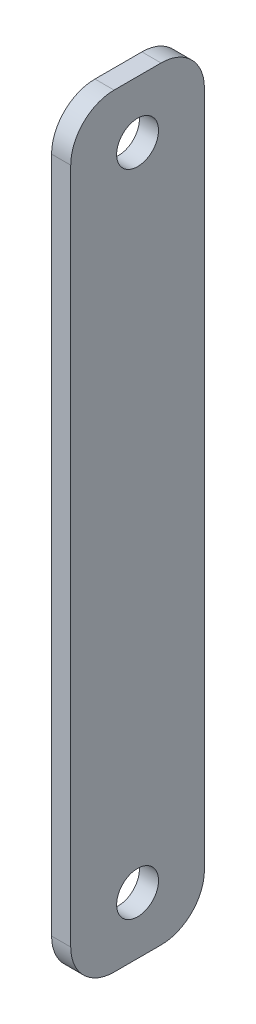
ISO-10303-21;
HEADER;
FILE_DESCRIPTION(('STEP AP214'),'2;1');
FILE_NAME('part.step','',(''),(''),'','','');
FILE_SCHEMA(('AUTOMOTIVE_DESIGN { 1 0 10303 214 1 1 1 1 }'));
ENDSEC;
DATA;
#1=APPLICATION_CONTEXT('core data for automotive mechanical design processes');
#2=APPLICATION_PROTOCOL_DEFINITION('international standard','automotive_design',2000,#1);
#3=PRODUCT_CONTEXT('',#1,'mechanical');
#4=PRODUCT('Part','Part','',(#3));
#5=PRODUCT_RELATED_PRODUCT_CATEGORY('part','',(#4));
#6=PRODUCT_DEFINITION_FORMATION('','',#4);
#7=PRODUCT_DEFINITION_CONTEXT('part definition',#1,'design');
#8=PRODUCT_DEFINITION('design','',#6,#7);
#9=PRODUCT_DEFINITION_SHAPE('','',#8);
#10=(LENGTH_UNIT() NAMED_UNIT(*) SI_UNIT(.MILLI.,.METRE.));
#11=(NAMED_UNIT(*) PLANE_ANGLE_UNIT() SI_UNIT($,.RADIAN.));
#12=(NAMED_UNIT(*) SI_UNIT($,.STERADIAN.) SOLID_ANGLE_UNIT());
#13=UNCERTAINTY_MEASURE_WITH_UNIT(LENGTH_MEASURE(1.E-05),#10,'distance_accuracy_value','');
#14=(GEOMETRIC_REPRESENTATION_CONTEXT(3) GLOBAL_UNCERTAINTY_ASSIGNED_CONTEXT((#13)) GLOBAL_UNIT_ASSIGNED_CONTEXT((#10,
#11,#12)) REPRESENTATION_CONTEXT('',''));
#15=CARTESIAN_POINT('',(0.,0.,0.));
#16=DIRECTION('',(0.,0.,1.));
#17=DIRECTION('',(1.,0.,0.));
#18=AXIS2_PLACEMENT_3D('',#15,#16,#17);
#19=CARTESIAN_POINT('',(0.6731,0.,0.));
#20=DIRECTION('',(1.,0.,0.));
#21=DIRECTION('',(0.,0.,-1.));
#22=AXIS2_PLACEMENT_3D('',#19,#20,#21);
#23=PLANE('',#22);
#24=CARTESIAN_POINT('',(0.6731,-22.8346,0.));
#25=DIRECTION('',(1.,0.,0.));
#26=DIRECTION('',(0.,0.,-1.));
#27=AXIS2_PLACEMENT_3D('',#24,#25,#26);
#28=CIRCLE('',#27,1.4732);
#29=CARTESIAN_POINT('',(0.6731,-22.8346,-1.4732));
#30=VERTEX_POINT('',#29);
#31=EDGE_CURVE('E129',#30,#30,#28,.F.);
#32=ORIENTED_EDGE('',*,*,#31,.T.);
#33=EDGE_LOOP('',(#32));
#34=FACE_BOUND('',#33,.T.);
#35=CARTESIAN_POINT('',(0.6731,22.8346,0.));
#36=DIRECTION('',(1.,0.,0.));
#37=DIRECTION('',(0.,0.,-1.));
#38=AXIS2_PLACEMENT_3D('',#35,#36,#37);
#39=CIRCLE('',#38,1.4732);
#40=CARTESIAN_POINT('',(0.6731,22.8346,-1.4732));
#41=VERTEX_POINT('',#40);
#42=EDGE_CURVE('E132',#41,#41,#39,.F.);
#43=ORIENTED_EDGE('',*,*,#42,.T.);
#44=EDGE_LOOP('',(#43));
#45=FACE_BOUND('',#44,.T.);
#46=DIRECTION('',(0.,1.,0.));
#47=VECTOR('',#46,1.);
#48=CARTESIAN_POINT('',(0.6731,-26.8478,-4.699));
#49=LINE('',#48,#47);
#50=CARTESIAN_POINT('',(0.6731,23.7998,-4.699));
#51=VERTEX_POINT('',#50);
#52=CARTESIAN_POINT('',(0.6731,-23.7998,-4.699));
#53=VERTEX_POINT('',#52);
#54=EDGE_CURVE('E92',#51,#53,#49,.F.);
#55=ORIENTED_EDGE('',*,*,#54,.F.);
#56=CARTESIAN_POINT('',(0.6731,23.7998,-1.651));
#57=DIRECTION('',(-1.,0.,0.));
#58=DIRECTION('',(0.,0.,1.));
#59=AXIS2_PLACEMENT_3D('',#56,#57,#58);
#60=CIRCLE('',#59,3.048);
#61=CARTESIAN_POINT('',(0.6731,26.8478,-1.651));
#62=VERTEX_POINT('',#61);
#63=EDGE_CURVE('E19',#62,#51,#60,.T.);
#64=ORIENTED_EDGE('',*,*,#63,.F.);
#65=DIRECTION('',(0.,0.,1.));
#66=VECTOR('',#65,1.);
#67=CARTESIAN_POINT('',(0.6731,26.8478,-4.699));
#68=LINE('',#67,#66);
#69=CARTESIAN_POINT('',(0.6731,26.8478,1.651));
#70=VERTEX_POINT('',#69);
#71=EDGE_CURVE('E78',#70,#62,#68,.F.);
#72=ORIENTED_EDGE('',*,*,#71,.F.);
#73=CARTESIAN_POINT('',(0.6731,23.7998,1.651));
#74=DIRECTION('',(-1.,0.,0.));
#75=DIRECTION('',(0.,0.,1.));
#76=AXIS2_PLACEMENT_3D('',#73,#74,#75);
#77=CIRCLE('',#76,3.048);
#78=CARTESIAN_POINT('',(0.6731,23.7998,4.699));
#79=VERTEX_POINT('',#78);
#80=EDGE_CURVE('E99',#79,#70,#77,.T.);
#81=ORIENTED_EDGE('',*,*,#80,.F.);
#82=DIRECTION('',(0.,1.,0.));
#83=VECTOR('',#82,1.);
#84=CARTESIAN_POINT('',(0.6731,26.8478,4.699));
#85=LINE('',#84,#83);
#86=CARTESIAN_POINT('',(0.6731,-23.7998,4.699));
#87=VERTEX_POINT('',#86);
#88=EDGE_CURVE('E110',#87,#79,#85,.T.);
#89=ORIENTED_EDGE('',*,*,#88,.F.);
#90=CARTESIAN_POINT('',(0.6731,-23.7998,1.651));
#91=DIRECTION('',(-1.,0.,0.));
#92=DIRECTION('',(0.,0.,1.));
#93=AXIS2_PLACEMENT_3D('',#90,#91,#92);
#94=CIRCLE('',#93,3.048);
#95=CARTESIAN_POINT('',(0.6731,-26.8478,1.651));
#96=VERTEX_POINT('',#95);
#97=EDGE_CURVE('E138',#96,#87,#94,.T.);
#98=ORIENTED_EDGE('',*,*,#97,.F.);
#99=DIRECTION('',(0.,0.,-1.));
#100=VECTOR('',#99,1.);
#101=CARTESIAN_POINT('',(0.6731,-26.8478,4.699));
#102=LINE('',#101,#100);
#103=CARTESIAN_POINT('',(0.6731,-26.8478,-1.651));
#104=VERTEX_POINT('',#103);
#105=EDGE_CURVE('E106',#104,#96,#102,.F.);
#106=ORIENTED_EDGE('',*,*,#105,.F.);
#107=CARTESIAN_POINT('',(0.6731,-23.7998,-1.651));
#108=DIRECTION('',(-1.,0.,0.));
#109=DIRECTION('',(0.,0.,1.));
#110=AXIS2_PLACEMENT_3D('',#107,#108,#109);
#111=CIRCLE('',#110,3.048);
#112=EDGE_CURVE('E136',#53,#104,#111,.T.);
#113=ORIENTED_EDGE('',*,*,#112,.F.);
#114=EDGE_LOOP('',(#55,#64,#72,#81,#89,#98,#106,#113));
#115=FACE_BOUND('',#114,.T.);
#116=ADVANCED_FACE('F16',(#34,#45,#115),#23,.T.);
#117=CARTESIAN_POINT('',(4.47425064,23.7998,-1.651));
#118=DIRECTION('',(-1.,0.,0.));
#119=DIRECTION('',(0.,0.,1.));
#120=AXIS2_PLACEMENT_3D('',#117,#118,#119);
#121=CYLINDRICAL_SURFACE('',#120,3.048);
#122=DIRECTION('',(-1.,0.,0.));
#123=VECTOR('',#122,1.);
#124=CARTESIAN_POINT('',(-0.6731,23.7998,-4.699));
#125=LINE('',#124,#123);
#126=CARTESIAN_POINT('',(-0.6731,23.7998,-4.699));
#127=VERTEX_POINT('',#126);
#128=EDGE_CURVE('E135',#127,#51,#125,.F.);
#129=ORIENTED_EDGE('',*,*,#128,.F.);
#130=CARTESIAN_POINT('',(-0.673099999999999,23.7998,-1.651));
#131=DIRECTION('',(-1.,0.,0.));
#132=DIRECTION('',(0.,0.,1.));
#133=AXIS2_PLACEMENT_3D('',#130,#131,#132);
#134=CIRCLE('',#133,3.048);
#135=CARTESIAN_POINT('',(-0.6731,26.8478,-1.651));
#136=VERTEX_POINT('',#135);
#137=EDGE_CURVE('E98',#127,#136,#134,.F.);
#138=ORIENTED_EDGE('',*,*,#137,.T.);
#139=DIRECTION('',(1.,0.,0.));
#140=VECTOR('',#139,1.);
#141=CARTESIAN_POINT('',(-0.6731,26.8478,-1.651));
#142=LINE('',#141,#140);
#143=EDGE_CURVE('E83',#62,#136,#142,.F.);
#144=ORIENTED_EDGE('',*,*,#143,.F.);
#145=ORIENTED_EDGE('',*,*,#63,.T.);
#146=EDGE_LOOP('',(#129,#138,#144,#145));
#147=FACE_BOUND('',#146,.T.);
#148=ADVANCED_FACE('F97',(#147),#121,.T.);
#149=CARTESIAN_POINT('',(-0.6731,26.8478,-4.699));
#150=DIRECTION('',(0.,1.,0.));
#151=DIRECTION('',(0.,0.,1.));
#152=AXIS2_PLACEMENT_3D('',#149,#150,#151);
#153=PLANE('',#152);
#154=ORIENTED_EDGE('',*,*,#71,.T.);
#155=ORIENTED_EDGE('',*,*,#143,.T.);
#156=DIRECTION('',(0.,0.,-1.));
#157=VECTOR('',#156,1.);
#158=CARTESIAN_POINT('',(-0.6731,26.8478,0.));
#159=LINE('',#158,#157);
#160=CARTESIAN_POINT('',(-0.6731,26.8478,1.651));
#161=VERTEX_POINT('',#160);
#162=EDGE_CURVE('E127',#136,#161,#159,.F.);
#163=ORIENTED_EDGE('',*,*,#162,.T.);
#164=DIRECTION('',(-1.,0.,0.));
#165=VECTOR('',#164,1.);
#166=CARTESIAN_POINT('',(4.47425064,26.8478,1.651));
#167=LINE('',#166,#165);
#168=EDGE_CURVE('E85',#70,#161,#167,.T.);
#169=ORIENTED_EDGE('',*,*,#168,.F.);
#170=EDGE_LOOP('',(#154,#155,#163,#169));
#171=FACE_BOUND('',#170,.T.);
#172=ADVANCED_FACE('F80',(#171),#153,.T.);
#173=CARTESIAN_POINT('',(4.47425064,23.7998,1.651));
#174=DIRECTION('',(-1.,0.,0.));
#175=DIRECTION('',(0.,0.,1.));
#176=AXIS2_PLACEMENT_3D('',#173,#174,#175);
#177=CYLINDRICAL_SURFACE('',#176,3.048);
#178=ORIENTED_EDGE('',*,*,#168,.T.);
#179=CARTESIAN_POINT('',(-0.673099999999999,23.7998,1.651));
#180=DIRECTION('',(-1.,0.,0.));
#181=DIRECTION('',(0.,0.,1.));
#182=AXIS2_PLACEMENT_3D('',#179,#180,#181);
#183=CIRCLE('',#182,3.048);
#184=CARTESIAN_POINT('',(-0.6731,23.7998,4.699));
#185=VERTEX_POINT('',#184);
#186=EDGE_CURVE('E124',#161,#185,#183,.F.);
#187=ORIENTED_EDGE('',*,*,#186,.T.);
#188=DIRECTION('',(1.,0.,0.));
#189=VECTOR('',#188,1.);
#190=CARTESIAN_POINT('',(-0.6731,23.7998,4.699));
#191=LINE('',#190,#189);
#192=EDGE_CURVE('E111',#79,#185,#191,.F.);
#193=ORIENTED_EDGE('',*,*,#192,.F.);
#194=ORIENTED_EDGE('',*,*,#80,.T.);
#195=EDGE_LOOP('',(#178,#187,#193,#194));
#196=FACE_BOUND('',#195,.T.);
#197=ADVANCED_FACE('F174',(#196),#177,.T.);
#198=CARTESIAN_POINT('',(-0.6731,26.8478,4.699));
#199=DIRECTION('',(0.,0.,1.));
#200=DIRECTION('',(1.,0.,0.));
#201=AXIS2_PLACEMENT_3D('',#198,#199,#200);
#202=PLANE('',#201);
#203=ORIENTED_EDGE('',*,*,#88,.T.);
#204=ORIENTED_EDGE('',*,*,#192,.T.);
#205=DIRECTION('',(0.,1.,0.));
#206=VECTOR('',#205,1.);
#207=CARTESIAN_POINT('',(-0.6731,0.,4.699));
#208=LINE('',#207,#206);
#209=CARTESIAN_POINT('',(-0.6731,-23.7998,4.699));
#210=VERTEX_POINT('',#209);
#211=EDGE_CURVE('E123',#185,#210,#208,.F.);
#212=ORIENTED_EDGE('',*,*,#211,.T.);
#213=DIRECTION('',(-1.,0.,0.));
#214=VECTOR('',#213,1.);
#215=CARTESIAN_POINT('',(4.47425064,-23.7998,4.699));
#216=LINE('',#215,#214);
#217=EDGE_CURVE('E109',#87,#210,#216,.T.);
#218=ORIENTED_EDGE('',*,*,#217,.F.);
#219=EDGE_LOOP('',(#203,#204,#212,#218));
#220=FACE_BOUND('',#219,.T.);
#221=ADVANCED_FACE('F171',(#220),#202,.T.);
#222=CARTESIAN_POINT('',(4.47425064,-23.7998,1.651));
#223=DIRECTION('',(-1.,0.,0.));
#224=DIRECTION('',(0.,0.,1.));
#225=AXIS2_PLACEMENT_3D('',#222,#223,#224);
#226=CYLINDRICAL_SURFACE('',#225,3.048);
#227=ORIENTED_EDGE('',*,*,#217,.T.);
#228=CARTESIAN_POINT('',(-0.673099999999999,-23.7998,1.651));
#229=DIRECTION('',(-1.,0.,0.));
#230=DIRECTION('',(0.,0.,1.));
#231=AXIS2_PLACEMENT_3D('',#228,#229,#230);
#232=CIRCLE('',#231,3.048);
#233=CARTESIAN_POINT('',(-0.6731,-26.8478,1.651));
#234=VERTEX_POINT('',#233);
#235=EDGE_CURVE('E120',#210,#234,#232,.F.);
#236=ORIENTED_EDGE('',*,*,#235,.T.);
#237=DIRECTION('',(1.,0.,0.));
#238=VECTOR('',#237,1.);
#239=CARTESIAN_POINT('',(-0.6731,-26.8478,1.651));
#240=LINE('',#239,#238);
#241=EDGE_CURVE('E108',#96,#234,#240,.F.);
#242=ORIENTED_EDGE('',*,*,#241,.F.);
#243=ORIENTED_EDGE('',*,*,#97,.T.);
#244=EDGE_LOOP('',(#227,#236,#242,#243));
#245=FACE_BOUND('',#244,.T.);
#246=ADVANCED_FACE('F169',(#245),#226,.T.);
#247=CARTESIAN_POINT('',(-0.6731,-26.8478,4.699));
#248=DIRECTION('',(0.,-1.,0.));
#249=DIRECTION('',(0.,0.,-1.));
#250=AXIS2_PLACEMENT_3D('',#247,#248,#249);
#251=PLANE('',#250);
#252=DIRECTION('',(0.,0.,-1.));
#253=VECTOR('',#252,1.);
#254=CARTESIAN_POINT('',(-0.6731,-26.8478,0.));
#255=LINE('',#254,#253);
#256=CARTESIAN_POINT('',(-0.673099999999999,-26.8478,-1.651));
#257=VERTEX_POINT('',#256);
#258=EDGE_CURVE('E119',#234,#257,#255,.T.);
#259=ORIENTED_EDGE('',*,*,#258,.T.);
#260=DIRECTION('',(-1.,0.,0.));
#261=VECTOR('',#260,1.);
#262=CARTESIAN_POINT('',(4.47425064,-26.8478,-1.651));
#263=LINE('',#262,#261);
#264=EDGE_CURVE('E105',#104,#257,#263,.T.);
#265=ORIENTED_EDGE('',*,*,#264,.F.);
#266=ORIENTED_EDGE('',*,*,#105,.T.);
#267=ORIENTED_EDGE('',*,*,#241,.T.);
#268=EDGE_LOOP('',(#259,#265,#266,#267));
#269=FACE_BOUND('',#268,.T.);
#270=ADVANCED_FACE('F167',(#269),#251,.T.);
#271=CARTESIAN_POINT('',(4.47425064,-23.7998,-1.651));
#272=DIRECTION('',(-1.,0.,0.));
#273=DIRECTION('',(0.,0.,1.));
#274=AXIS2_PLACEMENT_3D('',#271,#272,#273);
#275=CYLINDRICAL_SURFACE('',#274,3.048);
#276=ORIENTED_EDGE('',*,*,#264,.T.);
#277=CARTESIAN_POINT('',(-0.673099999999999,-23.7998,-1.651));
#278=DIRECTION('',(-1.,0.,0.));
#279=DIRECTION('',(0.,0.,1.));
#280=AXIS2_PLACEMENT_3D('',#277,#278,#279);
#281=CIRCLE('',#280,3.048);
#282=CARTESIAN_POINT('',(-0.6731,-23.7998,-4.699));
#283=VERTEX_POINT('',#282);
#284=EDGE_CURVE('E116',#257,#283,#281,.F.);
#285=ORIENTED_EDGE('',*,*,#284,.T.);
#286=DIRECTION('',(-1.,0.,0.));
#287=VECTOR('',#286,1.);
#288=CARTESIAN_POINT('',(-0.6731,-23.7998,-4.699));
#289=LINE('',#288,#287);
#290=EDGE_CURVE('E34',#53,#283,#289,.T.);
#291=ORIENTED_EDGE('',*,*,#290,.F.);
#292=ORIENTED_EDGE('',*,*,#112,.T.);
#293=EDGE_LOOP('',(#276,#285,#291,#292));
#294=FACE_BOUND('',#293,.T.);
#295=ADVANCED_FACE('F163',(#294),#275,.T.);
#296=CARTESIAN_POINT('',(-0.6731,-26.8478,-4.699));
#297=DIRECTION('',(0.,0.,-1.));
#298=DIRECTION('',(-1.,0.,0.));
#299=AXIS2_PLACEMENT_3D('',#296,#297,#298);
#300=PLANE('',#299);
#301=DIRECTION('',(0.,1.,0.));
#302=VECTOR('',#301,1.);
#303=CARTESIAN_POINT('',(-0.6731,0.,-4.699));
#304=LINE('',#303,#302);
#305=EDGE_CURVE('E115',#283,#127,#304,.T.);
#306=ORIENTED_EDGE('',*,*,#305,.T.);
#307=ORIENTED_EDGE('',*,*,#128,.T.);
#308=ORIENTED_EDGE('',*,*,#54,.T.);
#309=ORIENTED_EDGE('',*,*,#290,.T.);
#310=EDGE_LOOP('',(#306,#307,#308,#309));
#311=FACE_BOUND('',#310,.T.);
#312=ADVANCED_FACE('F157',(#311),#300,.T.);
#313=CARTESIAN_POINT('',(-0.6731,22.8346,0.));
#314=DIRECTION('',(1.,0.,0.));
#315=DIRECTION('',(0.,0.,-1.));
#316=AXIS2_PLACEMENT_3D('',#313,#314,#315);
#317=CYLINDRICAL_SURFACE('',#316,1.4732);
#318=ORIENTED_EDGE('',*,*,#42,.F.);
#319=EDGE_LOOP('',(#318));
#320=FACE_BOUND('',#319,.T.);
#321=CARTESIAN_POINT('',(-0.6731,22.8346,0.));
#322=DIRECTION('',(1.,0.,0.));
#323=DIRECTION('',(0.,0.,-1.));
#324=AXIS2_PLACEMENT_3D('',#321,#322,#323);
#325=CIRCLE('',#324,1.4732);
#326=CARTESIAN_POINT('',(-0.6731,22.8346,-1.4732));
#327=VERTEX_POINT('',#326);
#328=EDGE_CURVE('E25',#327,#327,#325,.F.);
#329=ORIENTED_EDGE('',*,*,#328,.T.);
#330=EDGE_LOOP('',(#329));
#331=FACE_BOUND('',#330,.T.);
#332=ADVANCED_FACE('F191',(#320,#331),#317,.F.);
#333=CARTESIAN_POINT('',(-0.6731,-22.8346,0.));
#334=DIRECTION('',(1.,0.,0.));
#335=DIRECTION('',(0.,0.,-1.));
#336=AXIS2_PLACEMENT_3D('',#333,#334,#335);
#337=CYLINDRICAL_SURFACE('',#336,1.4732);
#338=ORIENTED_EDGE('',*,*,#31,.F.);
#339=EDGE_LOOP('',(#338));
#340=FACE_BOUND('',#339,.T.);
#341=CARTESIAN_POINT('',(-0.6731,-22.8346,0.));
#342=DIRECTION('',(1.,0.,0.));
#343=DIRECTION('',(0.,0.,-1.));
#344=AXIS2_PLACEMENT_3D('',#341,#342,#343);
#345=CIRCLE('',#344,1.4732);
#346=CARTESIAN_POINT('',(-0.6731,-22.8346,-1.4732));
#347=VERTEX_POINT('',#346);
#348=EDGE_CURVE('E11',#347,#347,#345,.F.);
#349=ORIENTED_EDGE('',*,*,#348,.T.);
#350=EDGE_LOOP('',(#349));
#351=FACE_BOUND('',#350,.T.);
#352=ADVANCED_FACE('F185',(#340,#351),#337,.F.);
#353=CARTESIAN_POINT('',(-0.6731,0.,0.));
#354=DIRECTION('',(1.,0.,0.));
#355=DIRECTION('',(0.,0.,-1.));
#356=AXIS2_PLACEMENT_3D('',#353,#354,#355);
#357=PLANE('',#356);
#358=ORIENTED_EDGE('',*,*,#348,.F.);
#359=EDGE_LOOP('',(#358));
#360=FACE_BOUND('',#359,.T.);
#361=ORIENTED_EDGE('',*,*,#328,.F.);
#362=EDGE_LOOP('',(#361));
#363=FACE_BOUND('',#362,.T.);
#364=ORIENTED_EDGE('',*,*,#284,.F.);
#365=ORIENTED_EDGE('',*,*,#258,.F.);
#366=ORIENTED_EDGE('',*,*,#235,.F.);
#367=ORIENTED_EDGE('',*,*,#211,.F.);
#368=ORIENTED_EDGE('',*,*,#186,.F.);
#369=ORIENTED_EDGE('',*,*,#162,.F.);
#370=ORIENTED_EDGE('',*,*,#137,.F.);
#371=ORIENTED_EDGE('',*,*,#305,.F.);
#372=EDGE_LOOP('',(#364,#365,#366,#367,#368,#369,#370,#371));
#373=FACE_BOUND('',#372,.T.);
#374=ADVANCED_FACE('F160',(#360,#363,#373),#357,.F.);
#375=CLOSED_SHELL('',(#116,#148,#172,#197,#221,#246,#270,#295,#312,#332,#352,#374));
#376=MANIFOLD_SOLID_BREP('B1',#375);
#377=ADVANCED_BREP_SHAPE_REPRESENTATION('',(#18,#376),#14);
#378=SHAPE_DEFINITION_REPRESENTATION(#9,#377);
ENDSEC;
END-ISO-10303-21;
